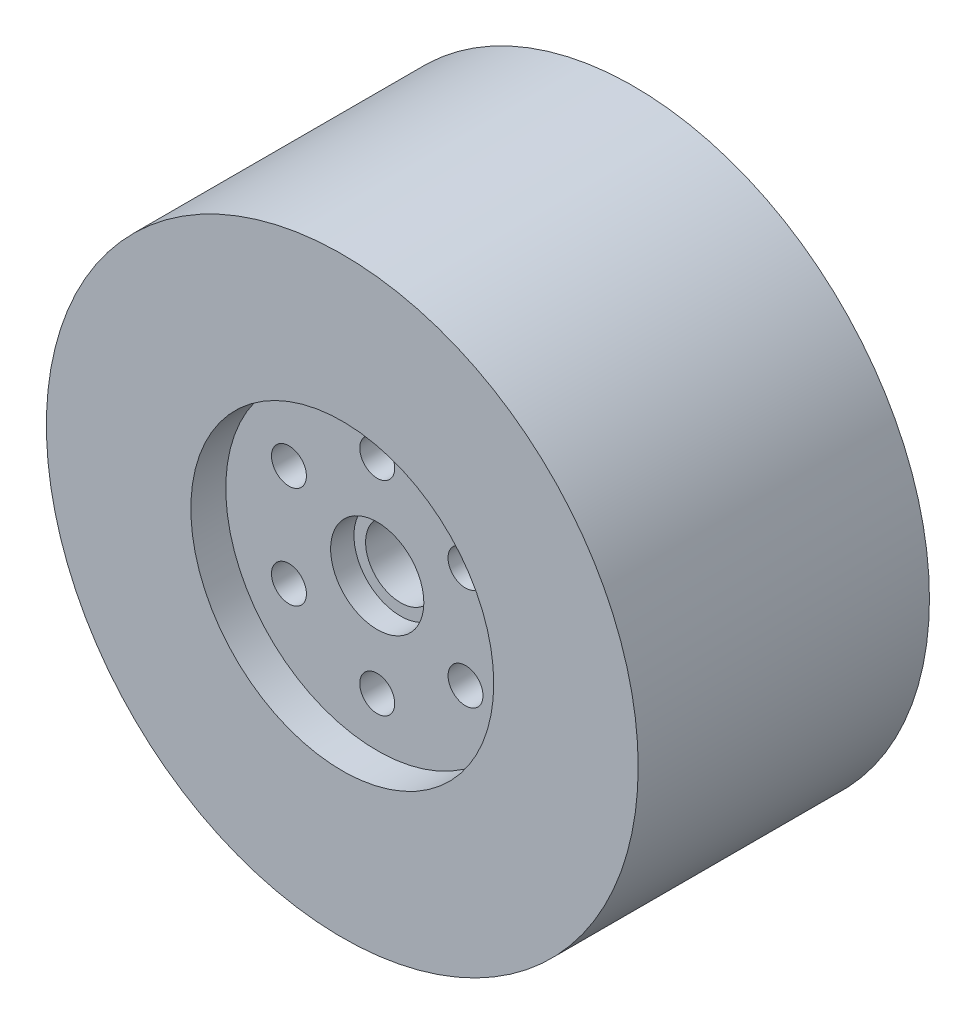
ISO-10303-21;
HEADER;
FILE_DESCRIPTION(('STEP AP214'),'2;1');
FILE_NAME('part.step','',(''),(''),'','','');
FILE_SCHEMA(('AUTOMOTIVE_DESIGN { 1 0 10303 214 1 1 1 1 }'));
ENDSEC;
DATA;
#1=APPLICATION_CONTEXT('core data for automotive mechanical design processes');
#2=APPLICATION_PROTOCOL_DEFINITION('international standard','automotive_design',2000,#1);
#3=PRODUCT_CONTEXT('',#1,'mechanical');
#4=PRODUCT('Part','Part','',(#3));
#5=PRODUCT_RELATED_PRODUCT_CATEGORY('part','',(#4));
#6=PRODUCT_DEFINITION_FORMATION('','',#4);
#7=PRODUCT_DEFINITION_CONTEXT('part definition',#1,'design');
#8=PRODUCT_DEFINITION('design','',#6,#7);
#9=PRODUCT_DEFINITION_SHAPE('','',#8);
#10=(LENGTH_UNIT() NAMED_UNIT(*) SI_UNIT(.MILLI.,.METRE.));
#11=(NAMED_UNIT(*) PLANE_ANGLE_UNIT() SI_UNIT($,.RADIAN.));
#12=(NAMED_UNIT(*) SI_UNIT($,.STERADIAN.) SOLID_ANGLE_UNIT());
#13=UNCERTAINTY_MEASURE_WITH_UNIT(LENGTH_MEASURE(1.E-05),#10,'distance_accuracy_value','');
#14=(GEOMETRIC_REPRESENTATION_CONTEXT(3) GLOBAL_UNCERTAINTY_ASSIGNED_CONTEXT((#13)) GLOBAL_UNIT_ASSIGNED_CONTEXT((#10,
#11,#12)) REPRESENTATION_CONTEXT('',''));
#15=CARTESIAN_POINT('',(0.,0.,0.));
#16=DIRECTION('',(0.,0.,1.));
#17=DIRECTION('',(1.,0.,0.));
#18=AXIS2_PLACEMENT_3D('',#15,#16,#17);
#19=CARTESIAN_POINT('',(0.,0.,0.));
#20=DIRECTION('',(0.,0.,1.));
#21=DIRECTION('',(1.,0.,0.));
#22=AXIS2_PLACEMENT_3D('',#19,#20,#21);
#23=CYLINDRICAL_SURFACE('',#22,3.);
#24=CARTESIAN_POINT('',(0.,0.,2.));
#25=DIRECTION('',(0.,0.,-1.));
#26=DIRECTION('',(-1.,0.,0.));
#27=AXIS2_PLACEMENT_3D('',#24,#25,#26);
#28=CIRCLE('',#27,3.);
#29=CARTESIAN_POINT('',(-3.,0.,2.));
#30=VERTEX_POINT('',#29);
#31=EDGE_CURVE('E48',#30,#30,#28,.F.);
#32=ORIENTED_EDGE('',*,*,#31,.F.);
#33=EDGE_LOOP('',(#32));
#34=FACE_BOUND('',#33,.T.);
#35=CARTESIAN_POINT('',(0.,0.,20.));
#36=DIRECTION('',(0.,0.,1.));
#37=DIRECTION('',(1.,0.,0.));
#38=AXIS2_PLACEMENT_3D('',#35,#36,#37);
#39=CIRCLE('',#38,3.);
#40=CARTESIAN_POINT('',(3.,0.,20.));
#41=VERTEX_POINT('',#40);
#42=EDGE_CURVE('E39',#41,#41,#39,.F.);
#43=ORIENTED_EDGE('',*,*,#42,.F.);
#44=EDGE_LOOP('',(#43));
#45=FACE_BOUND('',#44,.T.);
#46=ADVANCED_FACE('F35',(#34,#45),#23,.F.);
#47=CARTESIAN_POINT('',(0.,0.,25.));
#48=DIRECTION('',(0.,0.,-1.));
#49=DIRECTION('',(-1.,0.,0.));
#50=AXIS2_PLACEMENT_3D('',#47,#48,#49);
#51=CYLINDRICAL_SURFACE('',#50,25.4);
#52=CARTESIAN_POINT('',(0.,0.,25.));
#53=DIRECTION('',(0.,0.,1.));
#54=DIRECTION('',(1.,0.,0.));
#55=AXIS2_PLACEMENT_3D('',#52,#53,#54);
#56=CIRCLE('',#55,25.4);
#57=CARTESIAN_POINT('',(25.4,0.,25.));
#58=VERTEX_POINT('',#57);
#59=EDGE_CURVE('E10',#58,#58,#56,.T.);
#60=ORIENTED_EDGE('',*,*,#59,.F.);
#61=EDGE_LOOP('',(#60));
#62=FACE_BOUND('',#61,.T.);
#63=CARTESIAN_POINT('',(0.,0.,0.));
#64=DIRECTION('',(0.,0.,1.));
#65=DIRECTION('',(1.,0.,0.));
#66=AXIS2_PLACEMENT_3D('',#63,#64,#65);
#67=CIRCLE('',#66,25.4);
#68=CARTESIAN_POINT('',(25.4,0.,0.));
#69=VERTEX_POINT('',#68);
#70=EDGE_CURVE('E43',#69,#69,#67,.T.);
#71=ORIENTED_EDGE('',*,*,#70,.T.);
#72=EDGE_LOOP('',(#71));
#73=FACE_BOUND('',#72,.T.);
#74=ADVANCED_FACE('F37',(#62,#73),#51,.T.);
#75=CARTESIAN_POINT('',(0.,0.,25.));
#76=DIRECTION('',(0.,0.,1.));
#77=DIRECTION('',(1.,0.,0.));
#78=AXIS2_PLACEMENT_3D('',#75,#76,#77);
#79=PLANE('',#78);
#80=CARTESIAN_POINT('',(0.,0.,25.));
#81=DIRECTION('',(0.,0.,1.));
#82=DIRECTION('',(1.,0.,0.));
#83=AXIS2_PLACEMENT_3D('',#80,#81,#82);
#84=CIRCLE('',#83,13.);
#85=CARTESIAN_POINT('',(13.,0.,25.));
#86=VERTEX_POINT('',#85);
#87=EDGE_CURVE('E76',#86,#86,#84,.T.);
#88=ORIENTED_EDGE('',*,*,#87,.F.);
#89=EDGE_LOOP('',(#88));
#90=FACE_BOUND('',#89,.T.);
#91=ORIENTED_EDGE('',*,*,#59,.T.);
#92=EDGE_LOOP('',(#91));
#93=FACE_BOUND('',#92,.T.);
#94=ADVANCED_FACE('F95',(#90,#93),#79,.T.);
#95=CARTESIAN_POINT('',(0.,0.,0.));
#96=DIRECTION('',(0.,0.,1.));
#97=DIRECTION('',(1.,0.,0.));
#98=AXIS2_PLACEMENT_3D('',#95,#96,#97);
#99=PLANE('',#98);
#100=CARTESIAN_POINT('',(0.,0.,0.));
#101=DIRECTION('',(0.,0.,-1.));
#102=DIRECTION('',(-1.,0.,0.));
#103=AXIS2_PLACEMENT_3D('',#100,#101,#102);
#104=CIRCLE('',#103,4.);
#105=CARTESIAN_POINT('',(-4.,0.,0.));
#106=VERTEX_POINT('',#105);
#107=EDGE_CURVE('E51',#106,#106,#104,.T.);
#108=ORIENTED_EDGE('',*,*,#107,.F.);
#109=EDGE_LOOP('',(#108));
#110=FACE_BOUND('',#109,.T.);
#111=ORIENTED_EDGE('',*,*,#70,.F.);
#112=EDGE_LOOP('',(#111));
#113=FACE_BOUND('',#112,.T.);
#114=ADVANCED_FACE('F91',(#110,#113),#99,.F.);
#115=CARTESIAN_POINT('',(0.,0.,2.));
#116=DIRECTION('',(0.,0.,-1.));
#117=DIRECTION('',(-1.,0.,0.));
#118=AXIS2_PLACEMENT_3D('',#115,#116,#117);
#119=PLANE('',#118);
#120=CARTESIAN_POINT('',(0.,0.,2.));
#121=DIRECTION('',(0.,0.,-1.));
#122=DIRECTION('',(-1.,0.,0.));
#123=AXIS2_PLACEMENT_3D('',#120,#121,#122);
#124=CIRCLE('',#123,4.);
#125=CARTESIAN_POINT('',(-4.,0.,2.));
#126=VERTEX_POINT('',#125);
#127=EDGE_CURVE('E55',#126,#126,#124,.T.);
#128=ORIENTED_EDGE('',*,*,#127,.T.);
#129=EDGE_LOOP('',(#128));
#130=FACE_BOUND('',#129,.T.);
#131=ORIENTED_EDGE('',*,*,#31,.T.);
#132=EDGE_LOOP('',(#131));
#133=FACE_BOUND('',#132,.T.);
#134=ADVANCED_FACE('F94',(#130,#133),#119,.T.);
#135=CARTESIAN_POINT('',(0.,0.,2.));
#136=DIRECTION('',(0.,0.,-1.));
#137=DIRECTION('',(-1.,0.,0.));
#138=AXIS2_PLACEMENT_3D('',#135,#136,#137);
#139=CYLINDRICAL_SURFACE('',#138,4.);
#140=ORIENTED_EDGE('',*,*,#127,.F.);
#141=EDGE_LOOP('',(#140));
#142=FACE_BOUND('',#141,.T.);
#143=ORIENTED_EDGE('',*,*,#107,.T.);
#144=EDGE_LOOP('',(#143));
#145=FACE_BOUND('',#144,.T.);
#146=ADVANCED_FACE('F89',(#142,#145),#139,.F.);
#147=CARTESIAN_POINT('',(0.,0.,22.));
#148=DIRECTION('',(0.,0.,1.));
#149=DIRECTION('',(1.,0.,0.));
#150=AXIS2_PLACEMENT_3D('',#147,#148,#149);
#151=PLANE('',#150);
#152=CARTESIAN_POINT('',(7.57772228311379,4.37500000000009,22.));
#153=DIRECTION('',(0.,0.,1.));
#154=DIRECTION('',(0.50000000000001,-0.866025403784433,0.));
#155=AXIS2_PLACEMENT_3D('',#152,#153,#154);
#156=CIRCLE('',#155,1.5);
#157=CARTESIAN_POINT('',(8.3277222831138,3.07596189432344,22.));
#158=VERTEX_POINT('',#157);
#159=EDGE_CURVE('E205',#158,#158,#156,.T.);
#160=ORIENTED_EDGE('',*,*,#159,.F.);
#161=EDGE_LOOP('',(#160));
#162=FACE_BOUND('',#161,.T.);
#163=CARTESIAN_POINT('',(7.57772228311388,-4.37499999999993,22.));
#164=DIRECTION('',(0.,0.,1.));
#165=DIRECTION('',(-0.499999999999992,-0.866025403784443,0.));
#166=AXIS2_PLACEMENT_3D('',#163,#164,#165);
#167=CIRCLE('',#166,1.5);
#168=CARTESIAN_POINT('',(6.82772228311389,-5.67403810567659,22.));
#169=VERTEX_POINT('',#168);
#170=EDGE_CURVE('E199',#169,#169,#167,.T.);
#171=ORIENTED_EDGE('',*,*,#170,.F.);
#172=EDGE_LOOP('',(#171));
#173=FACE_BOUND('',#172,.T.);
#174=CARTESIAN_POINT('',(0.,-8.75,22.));
#175=DIRECTION('',(0.,0.,1.));
#176=DIRECTION('',(-1.,0.,0.));
#177=AXIS2_PLACEMENT_3D('',#174,#175,#176);
#178=CIRCLE('',#177,1.5);
#179=CARTESIAN_POINT('',(-1.5,-8.75,22.));
#180=VERTEX_POINT('',#179);
#181=EDGE_CURVE('E193',#180,#180,#178,.T.);
#182=ORIENTED_EDGE('',*,*,#181,.F.);
#183=EDGE_LOOP('',(#182));
#184=FACE_BOUND('',#183,.T.);
#185=CARTESIAN_POINT('',(-7.57772228311382,-4.37500000000004,22.));
#186=DIRECTION('',(0.,0.,1.));
#187=DIRECTION('',(-0.500000000000004,0.866025403784436,0.));
#188=AXIS2_PLACEMENT_3D('',#185,#186,#187);
#189=CIRCLE('',#188,1.5);
#190=CARTESIAN_POINT('',(-8.32772228311383,-3.07596189432338,22.));
#191=VERTEX_POINT('',#190);
#192=EDGE_CURVE('E184',#191,#191,#189,.T.);
#193=ORIENTED_EDGE('',*,*,#192,.F.);
#194=EDGE_LOOP('',(#193));
#195=FACE_BOUND('',#194,.T.);
#196=CARTESIAN_POINT('',(-7.57772228311385,4.37499999999998,22.));
#197=DIRECTION('',(0.,0.,1.));
#198=DIRECTION('',(0.499999999999998,0.86602540378444,0.));
#199=AXIS2_PLACEMENT_3D('',#196,#197,#198);
#200=CIRCLE('',#199,1.5);
#201=CARTESIAN_POINT('',(-6.82772228311385,5.67403810567664,22.));
#202=VERTEX_POINT('',#201);
#203=EDGE_CURVE('E69',#202,#202,#200,.T.);
#204=ORIENTED_EDGE('',*,*,#203,.F.);
#205=EDGE_LOOP('',(#204));
#206=FACE_BOUND('',#205,.T.);
#207=CARTESIAN_POINT('',(0.,0.,22.));
#208=DIRECTION('',(0.,0.,1.));
#209=DIRECTION('',(1.,0.,0.));
#210=AXIS2_PLACEMENT_3D('',#207,#208,#209);
#211=CIRCLE('',#210,4.);
#212=CARTESIAN_POINT('',(4.,0.,22.));
#213=VERTEX_POINT('',#212);
#214=EDGE_CURVE('E56',#213,#213,#211,.T.);
#215=ORIENTED_EDGE('',*,*,#214,.F.);
#216=EDGE_LOOP('',(#215));
#217=FACE_BOUND('',#216,.T.);
#218=CARTESIAN_POINT('',(0.,8.75,22.));
#219=DIRECTION('',(0.,0.,1.));
#220=DIRECTION('',(1.,0.,0.));
#221=AXIS2_PLACEMENT_3D('',#218,#219,#220);
#222=CIRCLE('',#221,1.5);
#223=CARTESIAN_POINT('',(1.5,8.75,22.));
#224=VERTEX_POINT('',#223);
#225=EDGE_CURVE('E62',#224,#224,#222,.T.);
#226=ORIENTED_EDGE('',*,*,#225,.F.);
#227=EDGE_LOOP('',(#226));
#228=FACE_BOUND('',#227,.T.);
#229=CARTESIAN_POINT('',(0.,0.,22.));
#230=DIRECTION('',(0.,0.,1.));
#231=DIRECTION('',(1.,0.,0.));
#232=AXIS2_PLACEMENT_3D('',#229,#230,#231);
#233=CIRCLE('',#232,13.);
#234=CARTESIAN_POINT('',(13.,0.,22.));
#235=VERTEX_POINT('',#234);
#236=EDGE_CURVE('E79',#235,#235,#233,.T.);
#237=ORIENTED_EDGE('',*,*,#236,.T.);
#238=EDGE_LOOP('',(#237));
#239=FACE_BOUND('',#238,.T.);
#240=ADVANCED_FACE('F115',(#162,#173,#184,#195,#206,#217,#228,#239),#151,.T.);
#241=CARTESIAN_POINT('',(0.,0.,22.));
#242=DIRECTION('',(0.,0.,1.));
#243=DIRECTION('',(1.,0.,0.));
#244=AXIS2_PLACEMENT_3D('',#241,#242,#243);
#245=CYLINDRICAL_SURFACE('',#244,13.);
#246=ORIENTED_EDGE('',*,*,#236,.F.);
#247=EDGE_LOOP('',(#246));
#248=FACE_BOUND('',#247,.T.);
#249=ORIENTED_EDGE('',*,*,#87,.T.);
#250=EDGE_LOOP('',(#249));
#251=FACE_BOUND('',#250,.T.);
#252=ADVANCED_FACE('F119',(#248,#251),#245,.F.);
#253=CARTESIAN_POINT('',(0.,8.75,17.));
#254=DIRECTION('',(0.,0.,1.));
#255=DIRECTION('',(1.,0.,0.));
#256=AXIS2_PLACEMENT_3D('',#253,#254,#255);
#257=CYLINDRICAL_SURFACE('',#256,1.5);
#258=CARTESIAN_POINT('',(0.,8.75,17.));
#259=DIRECTION('',(0.,0.,1.));
#260=DIRECTION('',(1.,0.,0.));
#261=AXIS2_PLACEMENT_3D('',#258,#259,#260);
#262=CIRCLE('',#261,1.5);
#263=CARTESIAN_POINT('',(1.5,8.75,17.));
#264=VERTEX_POINT('',#263);
#265=EDGE_CURVE('E73',#264,#264,#262,.T.);
#266=ORIENTED_EDGE('',*,*,#265,.F.);
#267=EDGE_LOOP('',(#266));
#268=FACE_BOUND('',#267,.T.);
#269=ORIENTED_EDGE('',*,*,#225,.T.);
#270=EDGE_LOOP('',(#269));
#271=FACE_BOUND('',#270,.T.);
#272=ADVANCED_FACE('F122',(#268,#271),#257,.F.);
#273=CARTESIAN_POINT('',(0.,8.75,17.));
#274=DIRECTION('',(0.,0.,1.));
#275=DIRECTION('',(1.,0.,0.));
#276=AXIS2_PLACEMENT_3D('',#273,#274,#275);
#277=PLANE('',#276);
#278=ORIENTED_EDGE('',*,*,#265,.T.);
#279=EDGE_LOOP('',(#278));
#280=FACE_BOUND('',#279,.T.);
#281=ADVANCED_FACE('F129',(#280),#277,.T.);
#282=CARTESIAN_POINT('',(0.,0.,20.));
#283=DIRECTION('',(0.,0.,1.));
#284=DIRECTION('',(1.,0.,0.));
#285=AXIS2_PLACEMENT_3D('',#282,#283,#284);
#286=PLANE('',#285);
#287=CARTESIAN_POINT('',(0.,0.,20.));
#288=DIRECTION('',(0.,0.,1.));
#289=DIRECTION('',(1.,0.,0.));
#290=AXIS2_PLACEMENT_3D('',#287,#288,#289);
#291=CIRCLE('',#290,4.);
#292=CARTESIAN_POINT('',(4.,0.,20.));
#293=VERTEX_POINT('',#292);
#294=EDGE_CURVE('E58',#293,#293,#291,.T.);
#295=ORIENTED_EDGE('',*,*,#294,.T.);
#296=EDGE_LOOP('',(#295));
#297=FACE_BOUND('',#296,.T.);
#298=ORIENTED_EDGE('',*,*,#42,.T.);
#299=EDGE_LOOP('',(#298));
#300=FACE_BOUND('',#299,.T.);
#301=ADVANCED_FACE('F133',(#297,#300),#286,.T.);
#302=CARTESIAN_POINT('',(0.,0.,20.));
#303=DIRECTION('',(0.,0.,1.));
#304=DIRECTION('',(1.,0.,0.));
#305=AXIS2_PLACEMENT_3D('',#302,#303,#304);
#306=CYLINDRICAL_SURFACE('',#305,4.);
#307=ORIENTED_EDGE('',*,*,#214,.T.);
#308=EDGE_LOOP('',(#307));
#309=FACE_BOUND('',#308,.T.);
#310=ORIENTED_EDGE('',*,*,#294,.F.);
#311=EDGE_LOOP('',(#310));
#312=FACE_BOUND('',#311,.T.);
#313=ADVANCED_FACE('F135',(#309,#312),#306,.F.);
#314=CARTESIAN_POINT('',(-7.57772228311385,4.37499999999998,17.));
#315=DIRECTION('',(0.,0.,1.));
#316=DIRECTION('',(1.,0.,0.));
#317=AXIS2_PLACEMENT_3D('',#314,#315,#316);
#318=CYLINDRICAL_SURFACE('',#317,1.5);
#319=CARTESIAN_POINT('',(-7.57772228311385,4.37499999999998,17.));
#320=DIRECTION('',(0.,0.,1.));
#321=DIRECTION('',(0.499999999999998,0.86602540378444,0.));
#322=AXIS2_PLACEMENT_3D('',#319,#320,#321);
#323=CIRCLE('',#322,1.5);
#324=CARTESIAN_POINT('',(-6.82772228311385,5.67403810567664,17.));
#325=VERTEX_POINT('',#324);
#326=EDGE_CURVE('E64',#325,#325,#323,.T.);
#327=ORIENTED_EDGE('',*,*,#326,.F.);
#328=EDGE_LOOP('',(#327));
#329=FACE_BOUND('',#328,.T.);
#330=ORIENTED_EDGE('',*,*,#203,.T.);
#331=EDGE_LOOP('',(#330));
#332=FACE_BOUND('',#331,.T.);
#333=ADVANCED_FACE('F138',(#329,#332),#318,.F.);
#334=CARTESIAN_POINT('',(-7.57772228311385,4.37499999999998,17.));
#335=DIRECTION('',(0.,0.,1.));
#336=DIRECTION('',(0.499999999999998,0.86602540378444,0.));
#337=AXIS2_PLACEMENT_3D('',#334,#335,#336);
#338=PLANE('',#337);
#339=ORIENTED_EDGE('',*,*,#326,.T.);
#340=EDGE_LOOP('',(#339));
#341=FACE_BOUND('',#340,.T.);
#342=ADVANCED_FACE('F143',(#341),#338,.T.);
#343=CARTESIAN_POINT('',(-7.57772228311382,-4.37500000000004,17.));
#344=DIRECTION('',(0.,0.,1.));
#345=DIRECTION('',(1.,0.,0.));
#346=AXIS2_PLACEMENT_3D('',#343,#344,#345);
#347=CYLINDRICAL_SURFACE('',#346,1.5);
#348=CARTESIAN_POINT('',(-7.57772228311382,-4.37500000000004,17.));
#349=DIRECTION('',(0.,0.,1.));
#350=DIRECTION('',(-0.500000000000004,0.866025403784436,0.));
#351=AXIS2_PLACEMENT_3D('',#348,#349,#350);
#352=CIRCLE('',#351,1.5);
#353=CARTESIAN_POINT('',(-8.32772228311383,-3.07596189432338,17.));
#354=VERTEX_POINT('',#353);
#355=EDGE_CURVE('E183',#354,#354,#352,.T.);
#356=ORIENTED_EDGE('',*,*,#355,.F.);
#357=EDGE_LOOP('',(#356));
#358=FACE_BOUND('',#357,.T.);
#359=ORIENTED_EDGE('',*,*,#192,.T.);
#360=EDGE_LOOP('',(#359));
#361=FACE_BOUND('',#360,.T.);
#362=ADVANCED_FACE('F147',(#358,#361),#347,.F.);
#363=CARTESIAN_POINT('',(-7.57772228311382,-4.37500000000004,17.));
#364=DIRECTION('',(0.,0.,1.));
#365=DIRECTION('',(-0.500000000000004,0.866025403784436,0.));
#366=AXIS2_PLACEMENT_3D('',#363,#364,#365);
#367=PLANE('',#366);
#368=ORIENTED_EDGE('',*,*,#355,.T.);
#369=EDGE_LOOP('',(#368));
#370=FACE_BOUND('',#369,.T.);
#371=ADVANCED_FACE('F169',(#370),#367,.T.);
#372=CARTESIAN_POINT('',(0.,-8.75,17.));
#373=DIRECTION('',(0.,0.,1.));
#374=DIRECTION('',(1.,0.,0.));
#375=AXIS2_PLACEMENT_3D('',#372,#373,#374);
#376=CYLINDRICAL_SURFACE('',#375,1.5);
#377=CARTESIAN_POINT('',(0.,-8.75,17.));
#378=DIRECTION('',(0.,0.,1.));
#379=DIRECTION('',(-1.,0.,0.));
#380=AXIS2_PLACEMENT_3D('',#377,#378,#379);
#381=CIRCLE('',#380,1.5);
#382=CARTESIAN_POINT('',(-1.5,-8.75,17.));
#383=VERTEX_POINT('',#382);
#384=EDGE_CURVE('E188',#383,#383,#381,.T.);
#385=ORIENTED_EDGE('',*,*,#384,.F.);
#386=EDGE_LOOP('',(#385));
#387=FACE_BOUND('',#386,.T.);
#388=ORIENTED_EDGE('',*,*,#181,.T.);
#389=EDGE_LOOP('',(#388));
#390=FACE_BOUND('',#389,.T.);
#391=ADVANCED_FACE('F166',(#387,#390),#376,.F.);
#392=CARTESIAN_POINT('',(0.,-8.75,17.));
#393=DIRECTION('',(0.,0.,1.));
#394=DIRECTION('',(-1.,0.,0.));
#395=AXIS2_PLACEMENT_3D('',#392,#393,#394);
#396=PLANE('',#395);
#397=ORIENTED_EDGE('',*,*,#384,.T.);
#398=EDGE_LOOP('',(#397));
#399=FACE_BOUND('',#398,.T.);
#400=ADVANCED_FACE('F161',(#399),#396,.T.);
#401=CARTESIAN_POINT('',(7.57772228311388,-4.37499999999993,17.));
#402=DIRECTION('',(0.,0.,1.));
#403=DIRECTION('',(1.,0.,0.));
#404=AXIS2_PLACEMENT_3D('',#401,#402,#403);
#405=CYLINDRICAL_SURFACE('',#404,1.5);
#406=CARTESIAN_POINT('',(7.57772228311388,-4.37499999999993,17.));
#407=DIRECTION('',(0.,0.,1.));
#408=DIRECTION('',(-0.499999999999992,-0.866025403784443,0.));
#409=AXIS2_PLACEMENT_3D('',#406,#407,#408);
#410=CIRCLE('',#409,1.5);
#411=CARTESIAN_POINT('',(6.82772228311389,-5.67403810567659,17.));
#412=VERTEX_POINT('',#411);
#413=EDGE_CURVE('E196',#412,#412,#410,.T.);
#414=ORIENTED_EDGE('',*,*,#413,.F.);
#415=EDGE_LOOP('',(#414));
#416=FACE_BOUND('',#415,.T.);
#417=ORIENTED_EDGE('',*,*,#170,.T.);
#418=EDGE_LOOP('',(#417));
#419=FACE_BOUND('',#418,.T.);
#420=ADVANCED_FACE('F158',(#416,#419),#405,.F.);
#421=CARTESIAN_POINT('',(7.57772228311388,-4.37499999999993,17.));
#422=DIRECTION('',(0.,0.,1.));
#423=DIRECTION('',(-0.499999999999992,-0.866025403784443,0.));
#424=AXIS2_PLACEMENT_3D('',#421,#422,#423);
#425=PLANE('',#424);
#426=ORIENTED_EDGE('',*,*,#413,.T.);
#427=EDGE_LOOP('',(#426));
#428=FACE_BOUND('',#427,.T.);
#429=ADVANCED_FACE('F153',(#428),#425,.T.);
#430=CARTESIAN_POINT('',(7.57772228311379,4.37500000000009,17.));
#431=DIRECTION('',(0.,0.,1.));
#432=DIRECTION('',(1.,0.,0.));
#433=AXIS2_PLACEMENT_3D('',#430,#431,#432);
#434=CYLINDRICAL_SURFACE('',#433,1.5);
#435=CARTESIAN_POINT('',(7.57772228311379,4.37500000000009,17.));
#436=DIRECTION('',(0.,0.,1.));
#437=DIRECTION('',(0.50000000000001,-0.866025403784433,0.));
#438=AXIS2_PLACEMENT_3D('',#435,#436,#437);
#439=CIRCLE('',#438,1.5);
#440=CARTESIAN_POINT('',(8.3277222831138,3.07596189432344,17.));
#441=VERTEX_POINT('',#440);
#442=EDGE_CURVE('E202',#441,#441,#439,.T.);
#443=ORIENTED_EDGE('',*,*,#442,.F.);
#444=EDGE_LOOP('',(#443));
#445=FACE_BOUND('',#444,.T.);
#446=ORIENTED_EDGE('',*,*,#159,.T.);
#447=EDGE_LOOP('',(#446));
#448=FACE_BOUND('',#447,.T.);
#449=ADVANCED_FACE('F149',(#445,#448),#434,.F.);
#450=CARTESIAN_POINT('',(7.57772228311379,4.37500000000009,17.));
#451=DIRECTION('',(0.,0.,1.));
#452=DIRECTION('',(0.50000000000001,-0.866025403784433,0.));
#453=AXIS2_PLACEMENT_3D('',#450,#451,#452);
#454=PLANE('',#453);
#455=ORIENTED_EDGE('',*,*,#442,.T.);
#456=EDGE_LOOP('',(#455));
#457=FACE_BOUND('',#456,.T.);
#458=ADVANCED_FACE('F152',(#457),#454,.T.);
#459=CLOSED_SHELL('',(#46,#74,#94,#114,#134,#146,#240,#252,#272,#281,#301,#313,#333,#342,#362,
#371,#391,#400,#420,#429,#449,#458));
#460=MANIFOLD_SOLID_BREP('B2',#459);
#461=ADVANCED_BREP_SHAPE_REPRESENTATION('',(#18,#460),#14);
#462=SHAPE_DEFINITION_REPRESENTATION(#9,#461);
ENDSEC;
END-ISO-10303-21;
